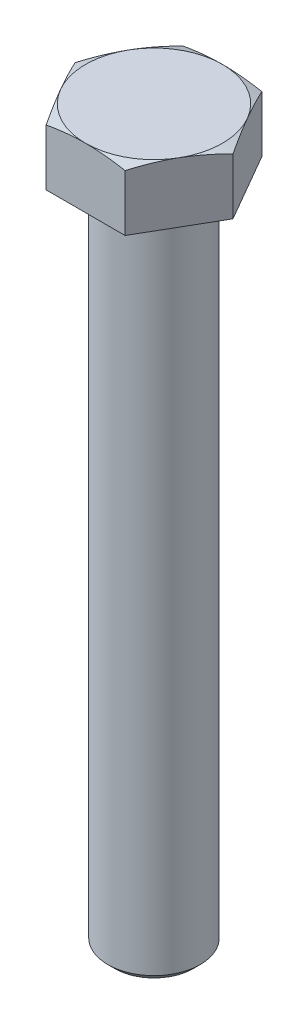
ISO-10303-21;
HEADER;
FILE_DESCRIPTION(('STEP AP214'),'2;1');
FILE_NAME('part.step','',(''),(''),'','','');
FILE_SCHEMA(('AUTOMOTIVE_DESIGN { 1 0 10303 214 1 1 1 1 }'));
ENDSEC;
DATA;
#1=APPLICATION_CONTEXT('core data for automotive mechanical design processes');
#2=APPLICATION_PROTOCOL_DEFINITION('international standard','automotive_design',2000,#1);
#3=PRODUCT_CONTEXT('',#1,'mechanical');
#4=PRODUCT('Part','Part','',(#3));
#5=PRODUCT_RELATED_PRODUCT_CATEGORY('part','',(#4));
#6=PRODUCT_DEFINITION_FORMATION('','',#4);
#7=PRODUCT_DEFINITION_CONTEXT('part definition',#1,'design');
#8=PRODUCT_DEFINITION('design','',#6,#7);
#9=PRODUCT_DEFINITION_SHAPE('','',#8);
#10=(LENGTH_UNIT() NAMED_UNIT(*) SI_UNIT(.MILLI.,.METRE.));
#11=(NAMED_UNIT(*) PLANE_ANGLE_UNIT() SI_UNIT($,.RADIAN.));
#12=(NAMED_UNIT(*) SI_UNIT($,.STERADIAN.) SOLID_ANGLE_UNIT());
#13=UNCERTAINTY_MEASURE_WITH_UNIT(LENGTH_MEASURE(1.E-05),#10,'distance_accuracy_value','');
#14=(GEOMETRIC_REPRESENTATION_CONTEXT(3) GLOBAL_UNCERTAINTY_ASSIGNED_CONTEXT((#13)) GLOBAL_UNIT_ASSIGNED_CONTEXT((#10,
#11,#12)) REPRESENTATION_CONTEXT('',''));
#15=CARTESIAN_POINT('',(0.,0.,0.));
#16=DIRECTION('',(0.,0.,1.));
#17=DIRECTION('',(1.,0.,0.));
#18=AXIS2_PLACEMENT_3D('',#15,#16,#17);
#19=CARTESIAN_POINT('',(-134.421042755759,85.6251261180788,156.216684572446));
#20=DIRECTION('',(0.,-1.,0.));
#21=DIRECTION('',(0.5,0.,-0.866025403784439));
#22=AXIS2_PLACEMENT_3D('',#19,#20,#21);
#23=PLANE('',#22);
#24=CARTESIAN_POINT('',(-134.421042755759,85.6251261180788,156.216684572446));
#25=DIRECTION('',(0.,-1.,0.));
#26=DIRECTION('',(0.5,0.,-0.866025403784439));
#27=AXIS2_PLACEMENT_3D('',#24,#25,#26);
#28=CIRCLE('',#27,7.647);
#29=CARTESIAN_POINT('',(-138.244542755759,85.6251261180788,162.839180835186));
#30=VERTEX_POINT('',#29);
#31=EDGE_CURVE('E271',#30,#30,#28,.T.);
#32=ORIENTED_EDGE('',*,*,#31,.T.);
#33=EDGE_LOOP('',(#32));
#34=FACE_BOUND('',#33,.T.);
#35=ADVANCED_FACE('F17',(#34),#23,.T.);
#36=CARTESIAN_POINT('',(-126.722076916115,227.845126118079,142.881684572446));
#37=DIRECTION('',(0.,-1.,0.));
#38=DIRECTION('',(0.866025403784439,0.,0.5));
#39=AXIS2_PLACEMENT_3D('',#36,#37,#38);
#40=PLANE('',#39);
#41=CARTESIAN_POINT('',(-134.421042755759,227.845126118079,156.216684572446));
#42=DIRECTION('',(0.,-1.,0.));
#43=DIRECTION('',(0.5,0.,-0.866025403784439));
#44=AXIS2_PLACEMENT_3D('',#41,#42,#43);
#45=CIRCLE('',#44,13.335);
#46=CARTESIAN_POINT('',(-122.872593996294,227.845126118079,149.549184572446));
#47=VERTEX_POINT('',#46);
#48=CARTESIAN_POINT('',(-122.872593996294,227.845126118079,162.884184572446));
#49=VERTEX_POINT('',#48);
#50=EDGE_CURVE('E11',#47,#49,#45,.T.);
#51=ORIENTED_EDGE('',*,*,#50,.F.);
#52=CARTESIAN_POINT('',(-134.421042755759,227.845126118079,156.216684572446));
#53=DIRECTION('',(0.,-1.,0.));
#54=DIRECTION('',(0.5,0.,-0.866025403784439));
#55=AXIS2_PLACEMENT_3D('',#52,#53,#54);
#56=CIRCLE('',#55,13.335);
#57=CARTESIAN_POINT('',(-134.421042755759,227.845126118079,142.881684572446));
#58=VERTEX_POINT('',#57);
#59=EDGE_CURVE('E214',#58,#47,#56,.T.);
#60=ORIENTED_EDGE('',*,*,#59,.F.);
#61=CARTESIAN_POINT('',(-134.421042755759,227.845126118079,156.216684572446));
#62=DIRECTION('',(0.,-1.,0.));
#63=DIRECTION('',(0.5,0.,-0.866025403784439));
#64=AXIS2_PLACEMENT_3D('',#61,#62,#63);
#65=CIRCLE('',#64,13.335);
#66=CARTESIAN_POINT('',(-145.969491515224,227.845126118079,149.549184572446));
#67=VERTEX_POINT('',#66);
#68=EDGE_CURVE('E451',#67,#58,#65,.T.);
#69=ORIENTED_EDGE('',*,*,#68,.F.);
#70=CARTESIAN_POINT('',(-134.421042755759,227.845126118079,156.216684572446));
#71=DIRECTION('',(0.,-1.,0.));
#72=DIRECTION('',(0.5,0.,-0.866025403784439));
#73=AXIS2_PLACEMENT_3D('',#70,#71,#72);
#74=CIRCLE('',#73,13.335);
#75=CARTESIAN_POINT('',(-145.969491515224,227.845126118079,162.884184572446));
#76=VERTEX_POINT('',#75);
#77=EDGE_CURVE('E46',#76,#67,#74,.T.);
#78=ORIENTED_EDGE('',*,*,#77,.F.);
#79=CARTESIAN_POINT('',(-134.421042755759,227.845126118079,156.216684572446));
#80=DIRECTION('',(0.,-1.,0.));
#81=DIRECTION('',(0.5,0.,-0.866025403784439));
#82=AXIS2_PLACEMENT_3D('',#79,#80,#81);
#83=CIRCLE('',#82,13.335);
#84=CARTESIAN_POINT('',(-134.421042755759,227.845126118079,169.551684572446));
#85=VERTEX_POINT('',#84);
#86=EDGE_CURVE('E345',#85,#76,#83,.T.);
#87=ORIENTED_EDGE('',*,*,#86,.F.);
#88=CARTESIAN_POINT('',(-134.421042755759,227.845126118079,156.216684572446));
#89=DIRECTION('',(0.,1.,0.));
#90=DIRECTION('',(-0.5,0.,0.866025403784439));
#91=AXIS2_PLACEMENT_3D('',#88,#89,#90);
#92=CIRCLE('',#91,13.335);
#93=EDGE_CURVE('E31',#85,#49,#92,.T.);
#94=ORIENTED_EDGE('',*,*,#93,.T.);
#95=EDGE_LOOP('',(#51,#60,#69,#78,#87,#94));
#96=FACE_BOUND('',#95,.T.);
#97=ADVANCED_FACE('F648',(#96),#40,.F.);
#98=CARTESIAN_POINT('',(-134.421042755759,227.845126118079,156.216684572446));
#99=DIRECTION('',(0.,-1.,0.));
#100=DIRECTION('',(0.5,0.,-0.866025403784439));
#101=AXIS2_PLACEMENT_3D('',#98,#99,#100);
#102=CONICAL_SURFACE('',#101,13.335,1.22173047639604);
#103=CARTESIAN_POINT('',(-122.872593996293,227.845126118079,162.884184572446));
#104=CARTESIAN_POINT('',(-122.765790007682,227.845139529122,162.699150701241));
#105=CARTESIAN_POINT('',(-122.658979524053,227.843270711422,162.514121087785));
#106=CARTESIAN_POINT('',(-122.44541330229,227.835805825219,162.14420583282));
#107=CARTESIAN_POINT('',(-122.338657559576,227.830211274858,161.959320163364));
#108=CARTESIAN_POINT('',(-122.124708196149,227.815299091096,161.588857858079));
#109=CARTESIAN_POINT('',(-122.017514733011,227.80596505759,161.403281793924));
#110=CARTESIAN_POINT('',(-121.803652725005,227.783729434206,161.032870627256));
#111=CARTESIAN_POINT('',(-121.696983623369,227.770839876457,160.848035121844));
#112=CARTESIAN_POINT('',(-121.48344316641,227.741496908851,160.478067254173));
#113=CARTESIAN_POINT('',(-121.376572087246,227.725033566838,160.292935521377));
#114=CARTESIAN_POINT('',(-121.162202468759,227.688555965655,159.921665318122));
#115=CARTESIAN_POINT('',(-121.054704703356,227.66851792925,159.735528743175));
#116=CARTESIAN_POINT('',(-120.842319573712,227.625631255484,159.367625790992));
#117=CARTESIAN_POINT('',(-120.737427122698,227.602854691653,159.185853923683));
#118=CARTESIAN_POINT('',(-120.527231042338,227.554140250437,158.821566761326));
#119=CARTESIAN_POINT('',(-120.421928494977,227.528185028157,158.639053164565));
#120=CARTESIAN_POINT('',(-120.210571777794,227.473118415611,158.272810997494));
#121=CARTESIAN_POINT('',(-120.104518924856,227.443981820732,158.089085463789));
#122=CARTESIAN_POINT('',(-119.891388364631,227.382560836724,157.719956415482));
#123=CARTESIAN_POINT('',(-119.78431246277,227.350244883217,157.534557118879));
#124=CARTESIAN_POINT('',(-119.568907364078,227.282470960763,157.161642245372));
#125=CARTESIAN_POINT('',(-119.460580732068,227.246976506213,156.97413183428));
#126=CARTESIAN_POINT('',(-119.242489323076,227.172849503322,156.59657962898));
#127=CARTESIAN_POINT('',(-119.132728231114,227.134176894393,156.40654356361));
#128=CARTESIAN_POINT('',(-119.023111076472,227.094280391494,156.216684572446));
#129=B_SPLINE_CURVE_WITH_KNOTS('',3,(#103,#104,#105,#106,#107,#108,#109,#110,#111,#112,#113,
#114,#115,#116,#117,#118,#119,#120,#121,#122,#123,#124,#125,#126,#127,#128),.UNSPECIFIED.,.F.,
.F.,(4,2,2,2,2,2,2,2,2,2,2,2,4),(0.,0.64092903534825,1.28159706788425,1.92510616174508,
2.56646374351991,3.2096271241323,3.85723989067546,4.49051020471908,5.12740443954068,
5.76977155017077,6.41932390012552,7.07763318267032,7.74612936264349),.UNSPECIFIED.);
#130=CARTESIAN_POINT('',(-119.023111076472,227.094280391494,156.216684572446));
#131=VERTEX_POINT('',#130);
#132=EDGE_CURVE('E367',#49,#131,#129,.T.);
#133=ORIENTED_EDGE('',*,*,#132,.T.);
#134=CARTESIAN_POINT('',(-119.023111076472,227.094280391494,156.216684572446));
#135=CARTESIAN_POINT('',(-119.132756640744,227.13418723506,156.026776378666));
#136=CARTESIAN_POINT('',(-119.24254601809,227.172869476151,155.836690887571));
#137=CARTESIAN_POINT('',(-119.460693942559,227.247014260088,155.459039454851));
#138=CARTESIAN_POINT('',(-119.569048806971,227.282516875322,155.271479245539));
#139=CARTESIAN_POINT('',(-119.784510642329,227.350305634547,154.89846422548));
#140=CARTESIAN_POINT('',(-119.891615048502,227.382628270402,154.713014581393));
#141=CARTESIAN_POINT('',(-120.104803311216,227.444061158296,154.343784126348));
#142=CARTESIAN_POINT('',(-120.210885360012,227.47320297367,154.160007531466));
#143=CARTESIAN_POINT('',(-120.422301431942,227.528278509732,153.79366222558));
#144=CARTESIAN_POINT('',(-120.527634136292,227.554237426006,153.611096548254));
#145=CARTESIAN_POINT('',(-120.737892556967,227.602957982891,153.246704351049));
#146=CARTESIAN_POINT('',(-120.842817186277,227.625736948077,153.064879523474));
#147=CARTESIAN_POINT('',(-121.055141013191,227.668600701295,152.697086697049));
#148=CARTESIAN_POINT('',(-121.162545011916,227.688617214428,152.511113489358));
#149=CARTESIAN_POINT('',(-121.376733844339,227.725058607975,152.140155056826));
#150=CARTESIAN_POINT('',(-121.483517923586,227.741506979666,151.955171710196));
#151=CARTESIAN_POINT('',(-121.696893012005,227.770827369729,151.585489515295));
#152=CARTESIAN_POINT('',(-121.803483747442,227.783709073214,151.400791278244));
#153=CARTESIAN_POINT('',(-122.017291721574,227.805945145915,151.030477050088));
#154=CARTESIAN_POINT('',(-122.124509677599,227.815284037549,150.844860541028));
#155=CARTESIAN_POINT('',(-122.338510290204,227.830203931071,150.474309848891));
#156=CARTESIAN_POINT('',(-122.445292797016,227.835801209464,150.28937623717));
#157=CARTESIAN_POINT('',(-122.658916761863,227.843269810107,149.919357888184));
#158=CARTESIAN_POINT('',(-122.765758224944,227.845139468884,149.734273120306));
#159=CARTESIAN_POINT('',(-122.872593996294,227.845126118079,149.549184572446));
#160=B_SPLINE_CURVE_WITH_KNOTS('',3,(#134,#135,#136,#137,#138,#139,#140,#141,#142,#143,#144,
#145,#146,#147,#148,#149,#150,#151,#152,#153,#154,#155,#156,#157,#158,#159),.UNSPECIFIED.,.F.,
.F.,(4,2,2,2,2,2,2,2,2,2,2,2,4),(0.,0.668669426706249,1.32715212151545,1.97687906689908,
2.61942310387391,3.25649786985065,3.88995371188233,4.53699789604124,5.17964340018021,
5.82052632409791,6.46417770261053,7.10501056923801,7.74612934740037),.UNSPECIFIED.);
#161=EDGE_CURVE('E501',#131,#47,#160,.T.);
#162=ORIENTED_EDGE('',*,*,#161,.T.);
#163=ORIENTED_EDGE('',*,*,#50,.T.);
#164=EDGE_LOOP('',(#133,#162,#163));
#165=FACE_BOUND('',#164,.T.);
#166=ADVANCED_FACE('F643',(#165),#102,.T.);
#167=CARTESIAN_POINT('',(-134.421042755759,227.845126118079,156.216684572446));
#168=DIRECTION('',(0.,-1.,0.));
#169=DIRECTION('',(0.5,0.,-0.866025403784439));
#170=AXIS2_PLACEMENT_3D('',#167,#168,#169);
#171=CONICAL_SURFACE('',#170,13.335,1.22173047639604);
#172=CARTESIAN_POINT('',(-126.722076916115,227.094280391494,169.551684572446));
#173=CARTESIAN_POINT('',(-126.612544264768,227.13414723875,169.361964974808));
#174=CARTESIAN_POINT('',(-126.50293004533,227.172791899346,169.172032662981));
#175=CARTESIAN_POINT('',(-126.285164977422,227.246868167139,168.794661600228));
#176=CARTESIAN_POINT('',(-126.177017243074,227.282339719239,168.607228885467));
#177=CARTESIAN_POINT('',(-125.96191888594,227.350072984148,168.234492654525));
#178=CARTESIAN_POINT('',(-125.854971445029,227.382371077056,168.049193929408));
#179=CARTESIAN_POINT('',(-125.642010175022,227.443761491557,167.680311864924));
#180=CARTESIAN_POINT('',(-125.535999084871,227.472885287675,167.496732190665));
#181=CARTESIAN_POINT('',(-125.324648471728,227.527931381378,167.130823308447));
#182=CARTESIAN_POINT('',(-125.219310911766,227.553878816315,166.94849675509));
#183=CARTESIAN_POINT('',(-125.009072637862,227.602582940768,166.584566275372));
#184=CARTESIAN_POINT('',(-124.904172845922,227.625356935044,166.402964135385));
#185=CARTESIAN_POINT('',(-124.691870469834,227.668248759611,166.035282499536));
#186=CARTESIAN_POINT('',(-124.584465628802,227.688293746064,165.849195783887));
#187=CARTESIAN_POINT('',(-124.370203549588,227.724789178958,165.478055094908));
#188=CARTESIAN_POINT('',(-124.263347564387,227.741263178747,165.293002720451));
#189=CARTESIAN_POINT('',(-124.049786414411,227.770631886611,164.923209386917));
#190=CARTESIAN_POINT('',(-123.943081644693,227.783536326839,164.738468973681));
#191=CARTESIAN_POINT('',(-123.729074953684,227.805827173462,164.367786376967));
#192=CARTESIAN_POINT('',(-123.621772918993,227.815194208103,164.181843090544));
#193=CARTESIAN_POINT('',(-123.407543219737,227.830159014542,163.81067710224));
#194=CARTESIAN_POINT('',(-123.300615978184,227.835773143533,163.6254548182));
#195=CARTESIAN_POINT('',(-123.086659196425,227.843264256765,163.254882224574));
#196=CARTESIAN_POINT('',(-122.979629631827,227.845139550998,163.069531894959));
#197=CARTESIAN_POINT('',(-122.872593996293,227.845126118079,162.884184572446));
#198=B_SPLINE_CURVE_WITH_KNOTS('',3,(#172,#173,#174,#175,#176,#177,#178,#179,#180,#181,#182,
#183,#184,#185,#186,#187,#188,#189,#190,#191,#192,#193,#194,#195,#196,#197),.UNSPECIFIED.,.F.,
.F.,(4,2,2,2,2,2,2,2,2,2,2,2,4),(0.,0.667999235771367,1.32583342383844,1.97492892204061,
2.61685336573369,3.25331461800518,3.88615671485517,4.53350368581595,5.1764414170247,
5.81760854744583,6.46223764349534,7.10403845220282,7.74612929843042),.UNSPECIFIED.);
#199=CARTESIAN_POINT('',(-126.722076916115,227.094280391494,169.551684572446));
#200=VERTEX_POINT('',#199);
#201=EDGE_CURVE('E378',#200,#49,#198,.T.);
#202=ORIENTED_EDGE('',*,*,#201,.T.);
#203=ORIENTED_EDGE('',*,*,#93,.F.);
#204=CARTESIAN_POINT('',(-134.421042755759,227.845126118079,169.551684572446));
#205=CARTESIAN_POINT('',(-134.207340796161,227.845139544043,169.55166257791));
#206=CARTESIAN_POINT('',(-133.993639277279,227.843269783899,169.551648249562));
#207=CARTESIAN_POINT('',(-133.566389330051,227.835801107808,169.551644122621));
#208=CARTESIAN_POINT('',(-133.3528408749,227.830203727574,169.551654313932));
#209=CARTESIAN_POINT('',(-132.92492693261,227.815283987172,169.551708510285));
#210=CARTESIAN_POINT('',(-132.710562019497,227.805945226263,169.551752665004));
#211=CARTESIAN_POINT('',(-132.282963727232,227.783710128196,169.551757024304));
#212=CARTESIAN_POINT('',(-132.069729521729,227.770829636219,169.551717597663));
#213=CARTESIAN_POINT('',(-131.642902471676,227.741510478687,169.551665465091));
#214=CARTESIAN_POINT('',(-131.429310309811,227.725061888441,169.551652834771));
#215=CARTESIAN_POINT('',(-131.000941927134,227.688619430133,169.551667441625));
#216=CARTESIAN_POINT('',(-130.786167730141,227.668601836371,169.551694955047));
#217=CARTESIAN_POINT('',(-130.361477645406,227.625737734377,169.551674408796));
#218=CARTESIAN_POINT('',(-130.151554817554,227.602959785089,169.551627930591));
#219=CARTESIAN_POINT('',(-129.730859922388,227.554240746452,169.551519339296));
#220=CARTESIAN_POINT('',(-129.520089867124,227.528282306657,169.551457138281));
#221=CARTESIAN_POINT('',(-129.097121367555,227.473207444465,169.551376230588));
#222=CARTESIAN_POINT('',(-128.884926213187,227.444065801177,169.551357902268));
#223=CARTESIAN_POINT('',(-128.458569415846,227.382632915935,169.551369872966));
#224=CARTESIAN_POINT('',(-128.244412331717,227.350310084719,169.551400718305));
#225=CARTESIAN_POINT('',(-127.813637416873,227.28252061049,169.551489691261));
#226=CARTESIAN_POINT('',(-127.597025346979,227.247017450554,169.551548181175));
#227=CARTESIAN_POINT('',(-127.160888134992,227.172871245615,169.551644911936));
#228=CARTESIAN_POINT('',(-126.941369802656,227.134188104291,169.551682825328));
#229=CARTESIAN_POINT('',(-126.722076916115,227.094280391494,169.551684572446));
#230=B_SPLINE_CURVE_WITH_KNOTS('',3,(#204,#205,#206,#207,#208,#209,#210,#211,#212,#213,#214,
#215,#216,#217,#218,#219,#220,#221,#222,#223,#224,#225,#226,#227,#228,#229),.UNSPECIFIED.,.F.,
.F.,(4,2,2,2,2,2,2,2,2,2,2,2,4),(0.,0.641096823772022,1.28192969039951,1.92560300316621,
2.56644219941095,3.20908728855609,3.85617561585054,4.48961798650377,5.1266842024838,
5.76922498897215,6.41895432906927,7.07744537608608,7.74612939189122),.UNSPECIFIED.);
#231=EDGE_CURVE('E357',#85,#200,#230,.T.);
#232=ORIENTED_EDGE('',*,*,#231,.T.);
#233=EDGE_LOOP('',(#202,#203,#232));
#234=FACE_BOUND('',#233,.T.);
#235=ADVANCED_FACE('F300',(#234),#171,.T.);
#236=CARTESIAN_POINT('',(-134.421042755759,227.845126118079,156.216684572446));
#237=DIRECTION('',(0.,-1.,0.));
#238=DIRECTION('',(0.5,0.,-0.866025403784439));
#239=AXIS2_PLACEMENT_3D('',#236,#237,#238);
#240=CONICAL_SURFACE('',#239,13.335,1.22173047639604);
#241=CARTESIAN_POINT('',(-142.120008595403,227.094280391494,169.551684572446));
#242=CARTESIAN_POINT('',(-141.900720493124,227.134187235049,169.551682825263));
#243=CARTESIAN_POINT('',(-141.681206940329,227.17286947613,169.551645180967));
#244=CARTESIAN_POINT('',(-141.245077243673,227.24701426005,169.551549252964));
#245=CARTESIAN_POINT('',(-141.028467905497,227.282516875277,169.551491292422));
#246=CARTESIAN_POINT('',(-140.597696504497,227.350305634493,169.551403379498));
#247=CARTESIAN_POINT('',(-140.383540198516,227.382628270346,169.551373064945));
#248=CARTESIAN_POINT('',(-139.957183113237,227.44406115824,169.551361841177));
#249=CARTESIAN_POINT('',(-139.744986889037,227.473202973616,169.551380389479));
#250=CARTESIAN_POINT('',(-139.322014511571,227.528278509686,169.551461353362));
#251=CARTESIAN_POINT('',(-139.111241644939,227.554237425967,169.551523394205));
#252=CARTESIAN_POINT('',(-138.690539534795,227.602957982869,169.551630359128));
#253=CARTESIAN_POINT('',(-138.480612300367,227.625736948065,169.551675378438));
#254=CARTESIAN_POINT('',(-138.055932455652,227.66860070132,169.551693963676));
#255=CARTESIAN_POINT('',(-137.841172933814,227.68861721448,169.551665976132));
#256=CARTESIAN_POINT('',(-137.412819091093,227.725058608052,169.55165222227));
#257=CARTESIAN_POINT('',(-137.199226774015,227.741506979746,169.55166617022));
#258=CARTESIAN_POINT('',(-136.772385057884,227.770827369781,169.551719020588));
#259=CARTESIAN_POINT('',(-136.559136325035,227.783709073238,169.55175785446));
#260=CARTESIAN_POINT('',(-136.131530808912,227.805945145915,169.551751831486));
#261=CARTESIAN_POINT('',(-135.917173218412,227.815284037547,169.551706612392));
#262=CARTESIAN_POINT('',(-135.48926659905,227.830203931064,169.551651991531));
#263=CARTESIAN_POINT('',(-135.275718139879,227.835801209461,169.55164243379));
#264=CARTESIAN_POINT('',(-134.848460867647,227.843269810106,169.551647827822));
#265=CARTESIAN_POINT('',(-134.63475202555,227.845139468886,169.551662790532));
#266=CARTESIAN_POINT('',(-134.421042755759,227.845126118079,169.551684572446));
#267=B_SPLINE_CURVE_WITH_KNOTS('',3,(#241,#242,#243,#244,#245,#246,#247,#248,#249,#250,#251,
#252,#253,#254,#255,#256,#257,#258,#259,#260,#261,#262,#263,#264,#265,#266),.UNSPECIFIED.,.F.,
.F.,(4,2,2,2,2,2,2,2,2,2,2,2,4),(0.,0.66866942653096,1.32715212123982,1.97687906659467,
2.61942310360859,3.25649786968804,3.88995371188157,4.53699789662004,5.17964340075013,
5.82052632409811,6.46417770344876,7.10501057007623,7.74612934739981),.UNSPECIFIED.);
#268=CARTESIAN_POINT('',(-142.120008595403,227.094280391494,169.551684572446));
#269=VERTEX_POINT('',#268);
#270=EDGE_CURVE('E358',#269,#85,#267,.T.);
#271=ORIENTED_EDGE('',*,*,#270,.T.);
#272=ORIENTED_EDGE('',*,*,#86,.T.);
#273=CARTESIAN_POINT('',(-145.969491515224,227.845126118079,162.884184572446));
#274=CARTESIAN_POINT('',(-145.862621487752,227.845139544046,163.069244900746));
#275=CARTESIAN_POINT('',(-145.755758319781,227.843269783898,163.254308680487));
#276=CARTESIAN_POINT('',(-145.54212977234,227.835801107804,163.624315924831));
#277=CARTESIAN_POINT('',(-145.435364370722,227.830203727565,163.809259407599));
#278=CARTESIAN_POINT('',(-145.221454334821,227.815283987169,164.179870850703));
#279=CARTESIAN_POINT('',(-145.114310117174,227.805945226265,164.365538388754));
#280=CARTESIAN_POINT('',(-144.900514746302,227.783710128233,164.735851551965));
#281=CARTESIAN_POINT('',(-144.793863499274,227.770829636301,164.920498077157));
#282=CARTESIAN_POINT('',(-144.580404826349,227.741510478814,165.290115078845));
#283=CARTESIAN_POINT('',(-144.473597807277,227.72506188856,165.475085001925));
#284=CARTESIAN_POINT('',(-144.259426265656,227.688619430213,165.846070207343));
#285=CARTESIAN_POINT('',(-144.152062994253,227.668601836412,166.032083875125));
#286=CARTESIAN_POINT('',(-143.939700158098,227.625737734391,166.399866004425));
#287=CARTESIAN_POINT('',(-143.834698492881,227.602959785122,166.581641266991));
#288=CARTESIAN_POINT('',(-143.624257002517,227.554240746514,166.945919437667));
#289=CARTESIAN_POINT('',(-143.51881810725,227.528282306727,167.128420559329));
#290=CARTESIAN_POINT('',(-143.307263789385,227.473207444548,167.494681571049));
#291=CARTESIAN_POINT('',(-143.201150339424,227.444065801264,167.678438801116));
#292=CARTESIAN_POINT('',(-142.987982307696,227.382632916022,168.04768060404));
#293=CARTESIAN_POINT('',(-142.880930478481,227.350310084802,168.233161501983));
#294=CARTESIAN_POINT('',(-142.665620073883,227.282520610559,168.606268008096));
#295=CARTESIAN_POINT('',(-142.55736469267,227.247017450614,168.793888808396));
#296=CARTESIAN_POINT('',(-142.339379857916,227.172871245648,169.171643079022));
#297=CARTESIAN_POINT('',(-142.229653525669,227.134188104307,169.361770488196));
#298=CARTESIAN_POINT('',(-142.120008595403,227.094280391494,169.551684572446));
#299=B_SPLINE_CURVE_WITH_KNOTS('',3,(#273,#274,#275,#276,#277,#278,#279,#280,#281,#282,#283,
#284,#285,#286,#287,#288,#289,#290,#291,#292,#293,#294,#295,#296,#297,#298),.UNSPECIFIED.,.F.,
.F.,(4,2,2,2,2,2,2,2,2,2,2,2,4),(0.,0.641096822809083,1.28192968943654,1.92560300316528,
2.56644219804608,3.20908728717653,3.8561756158501,4.48961798625283,5.12668420207381,
5.76922498850173,6.41895432864337,7.07744537581554,7.74612939189196),.UNSPECIFIED.);
#300=EDGE_CURVE('E127',#76,#269,#299,.T.);
#301=ORIENTED_EDGE('',*,*,#300,.T.);
#302=EDGE_LOOP('',(#271,#272,#301));
#303=FACE_BOUND('',#302,.T.);
#304=ADVANCED_FACE('F297',(#303),#240,.T.);
#305=CARTESIAN_POINT('',(-134.421042755759,227.845126118079,156.216684572446));
#306=DIRECTION('',(0.,-1.,0.));
#307=DIRECTION('',(0.5,0.,-0.866025403784439));
#308=AXIS2_PLACEMENT_3D('',#305,#306,#307);
#309=CONICAL_SURFACE('',#308,13.335,1.22173047639604);
#310=CARTESIAN_POINT('',(-149.818974435046,227.094280391494,156.216684572446));
#311=CARTESIAN_POINT('',(-149.709328870814,227.134187235045,156.406592766155));
#312=CARTESIAN_POINT('',(-149.599539493513,227.172869476121,156.596678257183));
#313=CARTESIAN_POINT('',(-149.38139156912,227.247014260034,156.974329689799));
#314=CARTESIAN_POINT('',(-149.273036704738,227.282516875259,157.161889899075));
#315=CARTESIAN_POINT('',(-149.057574869427,227.350305634471,157.534904919091));
#316=CARTESIAN_POINT('',(-148.950470463267,227.382628270323,157.720354563172));
#317=CARTESIAN_POINT('',(-148.737282200562,227.444061158217,158.089585018227));
#318=CARTESIAN_POINT('',(-148.631200151761,227.473202973594,158.273361613127));
#319=CARTESIAN_POINT('',(-148.419784079798,227.528278509667,158.63970691907));
#320=CARTESIAN_POINT('',(-148.314451375422,227.55423742595,158.822272596436));
#321=CARTESIAN_POINT('',(-148.104192954663,227.602957982861,159.186664793734));
#322=CARTESIAN_POINT('',(-147.999268325295,227.625736948063,159.368489621363));
#323=CARTESIAN_POINT('',(-147.786944498371,227.668600701289,159.736282447727));
#324=CARTESIAN_POINT('',(-147.679540499695,227.688617214418,159.922255655305));
#325=CARTESIAN_POINT('',(-147.465351667329,227.725058607959,160.29321408773));
#326=CARTESIAN_POINT('',(-147.358567588091,227.741506979649,160.478197434366));
#327=CARTESIAN_POINT('',(-147.145192499626,227.770827369717,160.847879629382));
#328=CARTESIAN_POINT('',(-147.038601764135,227.783709073209,161.032577866541));
#329=CARTESIAN_POINT('',(-146.824793789945,227.805945145914,161.402892094808));
#330=CARTESIAN_POINT('',(-146.717575833918,227.815284037549,161.588508603869));
#331=CARTESIAN_POINT('',(-146.503575221311,227.830203931071,161.959059296007));
#332=CARTESIAN_POINT('',(-146.396792714499,227.835801209464,162.143992907729));
#333=CARTESIAN_POINT('',(-146.183168749653,227.843269810107,162.514011256713));
#334=CARTESIAN_POINT('',(-146.076327286573,227.845139468884,162.699096024589));
#335=CARTESIAN_POINT('',(-145.969491515224,227.845126118079,162.884184572446));
#336=B_SPLINE_CURVE_WITH_KNOTS('',3,(#310,#311,#312,#313,#314,#315,#316,#317,#318,#319,#320,
#321,#322,#323,#324,#325,#326,#327,#328,#329,#330,#331,#332,#333,#334,#335),.UNSPECIFIED.,.F.,
.F.,(4,2,2,2,2,2,2,2,2,2,2,2,4),(0.,0.668669426458363,1.32715212112566,1.9768790664686,
2.61942310349868,3.25649786962069,3.88995371188126,4.53699789567316,5.17964339981441,
5.82052632409715,6.46417770261706,7.10501056924455,7.74612934739961),.UNSPECIFIED.);
#337=CARTESIAN_POINT('',(-149.818974435046,227.094280391494,156.216684572446));
#338=VERTEX_POINT('',#337);
#339=EDGE_CURVE('E318',#338,#76,#336,.T.);
#340=ORIENTED_EDGE('',*,*,#339,.T.);
#341=ORIENTED_EDGE('',*,*,#77,.T.);
#342=CARTESIAN_POINT('',(-145.969491515224,227.845126118079,149.549184572446));
#343=CARTESIAN_POINT('',(-146.076485333089,227.845139626545,149.734547565022));
#344=CARTESIAN_POINT('',(-146.183485521508,227.843264230413,149.919906366467));
#345=CARTESIAN_POINT('',(-146.397429837302,227.835773041345,150.290477666725));
#346=CARTESIAN_POINT('',(-146.504373969436,227.830158809979,150.475690194311));
#347=CARTESIAN_POINT('',(-146.718701600634,227.815194157451,150.846808129764));
#348=CARTESIAN_POINT('',(-146.826084941669,227.805827254209,151.032712961762));
#349=CARTESIAN_POINT('',(-147.040097072236,227.783537386676,151.403384054281));
#350=CARTESIAN_POINT('',(-147.146726775105,227.770634163447,151.58815097811));
#351=CARTESIAN_POINT('',(-147.360189887318,227.741266693666,151.957983923532));
#352=CARTESIAN_POINT('',(-147.467023019366,227.72479247453,152.143049312172));
#353=CARTESIAN_POINT('',(-147.681317280605,227.688295971878,152.51418826475));
#354=CARTESIAN_POINT('',(-147.788777633303,227.668249899771,152.700259931497));
#355=CARTESIAN_POINT('',(-148.001051517798,227.625357723562,153.067969882412));
#356=CARTESIAN_POINT('',(-148.105870213544,227.602584747727,153.249613741011));
#357=CARTESIAN_POINT('',(-148.315919089091,227.553882145435,153.613645216054));
#358=CARTESIAN_POINT('',(-148.421148187711,227.527935188301,153.796031134597));
#359=CARTESIAN_POINT('',(-148.632357373305,227.472889770293,154.162017180402));
#360=CARTESIAN_POINT('',(-148.738336144326,227.443766146723,154.345614275652));
#361=CARTESIAN_POINT('',(-148.95131725194,227.382375734877,154.714484553901));
#362=CARTESIAN_POINT('',(-149.058317785379,227.350077446109,154.899753527184));
#363=CARTESIAN_POINT('',(-149.273570333034,227.282343464304,155.27240480482));
#364=CARTESIAN_POINT('',(-149.38181978712,227.246871366071,155.459781954545));
#365=CARTESIAN_POINT('',(-149.599754644251,227.172793673509,155.837063690662));
#366=CARTESIAN_POINT('',(-149.709436371127,227.134148110308,156.026962560674));
#367=CARTESIAN_POINT('',(-149.818974435046,227.094280391494,156.216684572446));
#368=B_SPLINE_CURVE_WITH_KNOTS('',3,(#342,#343,#344,#345,#346,#347,#348,#349,#350,#351,#352,
#353,#354,#355,#356,#357,#358,#359,#360,#361,#362,#363,#364,#365,#366,#367),.UNSPECIFIED.,.F.,
.F.,(4,2,2,2,2,2,2,2,2,2,2,2,4),(0.,0.642068808616925,1.28386961732441,1.92852073071069,
2.56964399148841,3.2125813057023,3.85997256379276,4.49280115192826,5.12925383112512,
5.77117501603899,6.42027291594796,7.07811547898077,7.74612934283124),.UNSPECIFIED.);
#369=EDGE_CURVE('E279',#67,#338,#368,.T.);
#370=ORIENTED_EDGE('',*,*,#369,.T.);
#371=EDGE_LOOP('',(#340,#341,#370));
#372=FACE_BOUND('',#371,.T.);
#373=ADVANCED_FACE('F286',(#372),#309,.T.);
#374=CARTESIAN_POINT('',(-134.421042755759,227.845126118079,156.216684572446));
#375=DIRECTION('',(0.,-1.,0.));
#376=DIRECTION('',(0.5,0.,-0.866025403784439));
#377=AXIS2_PLACEMENT_3D('',#374,#375,#376);
#378=CONICAL_SURFACE('',#377,13.335,1.22173047639604);
#379=CARTESIAN_POINT('',(-134.421042755759,227.845126118079,142.881684572446));
#380=CARTESIAN_POINT('',(-134.634744714768,227.845139544048,142.881706566996));
#381=CARTESIAN_POINT('',(-134.84844623306,227.843269783897,142.881720895295));
#382=CARTESIAN_POINT('',(-135.275696179698,227.835801107801,142.881725022136));
#383=CARTESIAN_POINT('',(-135.489244634848,227.830203727559,142.881714830776));
#384=CARTESIAN_POINT('',(-135.917158577729,227.815283987166,142.881660634451));
#385=CARTESIAN_POINT('',(-136.131523491431,227.805945226266,142.881616479809));
#386=CARTESIAN_POINT('',(-136.559121783687,227.783710128255,142.881612120666));
#387=CARTESIAN_POINT('',(-136.772355988592,227.770829636347,142.881651547385));
#388=CARTESIAN_POINT('',(-137.19918303804,227.741510478885,142.881703679981));
#389=CARTESIAN_POINT('',(-137.412775199897,227.725061888629,142.881716310245));
#390=CARTESIAN_POINT('',(-137.841143583173,227.688619430259,142.881701703305));
#391=CARTESIAN_POINT('',(-138.055917780772,227.668601836435,142.881674189854));
#392=CARTESIAN_POINT('',(-138.480607866102,227.625737734375,142.881694736087));
#393=CARTESIAN_POINT('',(-138.690530693945,227.602959785092,142.881741214303));
#394=CARTESIAN_POINT('',(-139.111225589096,227.55424074646,142.881849805608));
#395=CARTESIAN_POINT('',(-139.321995644354,227.528282306665,142.881912006621));
#396=CARTESIAN_POINT('',(-139.744964143915,227.473207444474,142.881992914312));
#397=CARTESIAN_POINT('',(-139.957159298281,227.444065801187,142.882011242632));
#398=CARTESIAN_POINT('',(-140.383516095621,227.382632915945,142.881999271933));
#399=CARTESIAN_POINT('',(-140.597673179751,227.350310084728,142.881968426592));
#400=CARTESIAN_POINT('',(-141.028448094603,227.282520610498,142.881879453634));
#401=CARTESIAN_POINT('',(-141.245060164503,227.247017450561,142.88182096372));
#402=CARTESIAN_POINT('',(-141.681197376506,227.172871245619,142.881724232957));
#403=CARTESIAN_POINT('',(-141.900715708852,227.134188104293,142.881686319564));
#404=CARTESIAN_POINT('',(-142.120008595403,227.094280391494,142.881684572446));
#405=B_SPLINE_CURVE_WITH_KNOTS('',3,(#379,#380,#381,#382,#383,#384,#385,#386,#387,#388,#389,
#390,#391,#392,#393,#394,#395,#396,#397,#398,#399,#400,#401,#402,#403,#404),.UNSPECIFIED.,.F.,
.F.,(4,2,2,2,2,2,2,2,2,2,2,2,4),(0.,0.641096822003138,1.28192968863063,1.92560300316465,
2.56644219760636,3.20908728672896,3.85617561585044,4.48961798647506,5.1266842024369,
5.76922498891837,6.41895432902056,7.0774453760551,7.74612939189117),.UNSPECIFIED.);
#406=CARTESIAN_POINT('',(-142.120008595403,227.094280391494,142.881684572446));
#407=VERTEX_POINT('',#406);
#408=EDGE_CURVE('E424',#58,#407,#405,.T.);
#409=ORIENTED_EDGE('',*,*,#408,.T.);
#410=CARTESIAN_POINT('',(-142.120008595403,227.094280391494,142.881684572446));
#411=CARTESIAN_POINT('',(-142.229620328692,227.134176022721,143.071541153795));
#412=CARTESIAN_POINT('',(-142.339313680133,227.172847728898,143.261610794805));
#413=CARTESIAN_POINT('',(-142.557234705446,227.246973306806,143.639252668901));
#414=CARTESIAN_POINT('',(-142.665459258823,227.282467215131,143.826818851935));
#415=CARTESIAN_POINT('',(-142.880709621824,227.350240420579,144.199818993242));
#416=CARTESIAN_POINT('',(-142.987732242233,227.382556178185,144.385248150799));
#417=CARTESIAN_POINT('',(-143.200842888062,227.443977164846,144.754389029995));
#418=CARTESIAN_POINT('',(-143.306928168507,227.473113932289,144.938097080418));
#419=CARTESIAN_POINT('',(-143.518426823646,227.528181220621,145.304261789876));
#420=CARTESIAN_POINT('',(-143.623838231804,227.554136920755,145.486715791209));
#421=CARTESIAN_POINT('',(-143.834224334272,227.60285288438,145.850901598846));
#422=CARTESIAN_POINT('',(-143.939198106647,227.62563046683,146.032631617893));
#423=CARTESIAN_POINT('',(-144.151612011133,227.668516792046,146.400506111279));
#424=CARTESIAN_POINT('',(-144.259054365339,227.68855374576,146.586657696589));
#425=CARTESIAN_POINT('',(-144.473392438618,227.725030280186,146.957929287716));
#426=CARTESIAN_POINT('',(-144.580286904884,227.741493403036,147.143047697688));
#427=CARTESIAN_POINT('',(-144.793926221231,227.770837605608,147.512975459668));
#428=CARTESIAN_POINT('',(-144.900670678655,227.783728377219,147.697784268561));
#429=CARTESIAN_POINT('',(-145.114527333928,227.805964977106,148.068206890538));
#430=CARTESIAN_POINT('',(-145.221639598849,227.815299141518,148.253821367116));
#431=CARTESIAN_POINT('',(-145.4354906499,227.830211478596,148.624331965326));
#432=CARTESIAN_POINT('',(-145.542229016436,227.835805926995,148.809227671569));
#433=CARTESIAN_POINT('',(-145.75580667991,227.843270737654,149.179144790812));
#434=CARTESIAN_POINT('',(-145.862646000605,227.845139453869,149.364166223262));
#435=CARTESIAN_POINT('',(-145.969491515224,227.845126118079,149.549184572446));
#436=B_SPLINE_CURVE_WITH_KNOTS('',3,(#410,#411,#412,#413,#414,#415,#416,#417,#418,#419,#420,
#421,#422,#423,#424,#425,#426,#427,#428,#429,#430,#431,#432,#433,#434,#435),.UNSPECIFIED.,.F.,
.F.,(4,2,2,2,2,2,2,2,2,2,2,2,4),(0.,0.668481549913369,1.32678245667664,1.97633240502762,
2.61870277516043,3.2556055840495,3.8888894076707,4.53645793820685,5.17962173495515,
5.82102313615711,6.46451026555659,7.10517829809258,7.7461293180556),.UNSPECIFIED.);
#437=EDGE_CURVE('E465',#407,#67,#436,.T.);
#438=ORIENTED_EDGE('',*,*,#437,.T.);
#439=ORIENTED_EDGE('',*,*,#68,.T.);
#440=EDGE_LOOP('',(#409,#438,#439));
#441=FACE_BOUND('',#440,.T.);
#442=ADVANCED_FACE('F296',(#441),#378,.T.);
#443=CARTESIAN_POINT('',(-149.818974435046,216.125126118079,156.216684572446));
#444=DIRECTION('',(0.866025403784439,0.,0.5));
#445=DIRECTION('',(0.5,0.,-0.866025403784439));
#446=AXIS2_PLACEMENT_3D('',#443,#444,#445);
#447=PLANE('',#446);
#448=ORIENTED_EDGE('',*,*,#437,.F.);
#449=DIRECTION('',(0.,1.,0.));
#450=VECTOR('',#449,1.);
#451=CARTESIAN_POINT('',(-142.120008595403,216.125126118079,142.881684572446));
#452=LINE('',#451,#450);
#453=CARTESIAN_POINT('',(-142.120008595403,216.125126118079,142.881684572446));
#454=VERTEX_POINT('',#453);
#455=EDGE_CURVE('E420',#454,#407,#452,.T.);
#456=ORIENTED_EDGE('',*,*,#455,.F.);
#457=DIRECTION('',(0.5,0.,-0.866025403784439));
#458=VECTOR('',#457,1.);
#459=CARTESIAN_POINT('',(-149.818974435046,216.125126118079,156.216684572446));
#460=LINE('',#459,#458);
#461=CARTESIAN_POINT('',(-145.969491515224,216.125126118079,149.549184572446));
#462=VERTEX_POINT('',#461);
#463=EDGE_CURVE('E247',#462,#454,#460,.T.);
#464=ORIENTED_EDGE('',*,*,#463,.F.);
#465=DIRECTION('',(0.5,0.,-0.866025403784439));
#466=VECTOR('',#465,1.);
#467=CARTESIAN_POINT('',(-149.818974435046,216.125126118079,156.216684572446));
#468=LINE('',#467,#466);
#469=CARTESIAN_POINT('',(-149.818974435046,216.125126118079,156.216684572446));
#470=VERTEX_POINT('',#469);
#471=EDGE_CURVE('E251',#470,#462,#468,.T.);
#472=ORIENTED_EDGE('',*,*,#471,.F.);
#473=DIRECTION('',(0.,1.,0.));
#474=VECTOR('',#473,1.);
#475=CARTESIAN_POINT('',(-149.818974435046,216.125126118079,156.216684572446));
#476=LINE('',#475,#474);
#477=EDGE_CURVE('E457',#470,#338,#476,.T.);
#478=ORIENTED_EDGE('',*,*,#477,.T.);
#479=ORIENTED_EDGE('',*,*,#369,.F.);
#480=EDGE_LOOP('',(#448,#456,#464,#472,#478,#479));
#481=FACE_BOUND('',#480,.T.);
#482=ADVANCED_FACE('F334',(#481),#447,.F.);
#483=CARTESIAN_POINT('',(-142.120008595403,216.125126118079,169.551684572446));
#484=DIRECTION('',(0.866025403784439,0.,-0.5));
#485=DIRECTION('',(0.,1.,0.));
#486=AXIS2_PLACEMENT_3D('',#483,#484,#485);
#487=PLANE('',#486);
#488=ORIENTED_EDGE('',*,*,#339,.F.);
#489=ORIENTED_EDGE('',*,*,#477,.F.);
#490=DIRECTION('',(-0.5,0.,-0.866025403784439));
#491=VECTOR('',#490,1.);
#492=CARTESIAN_POINT('',(-142.120008595403,216.125126118079,169.551684572446));
#493=LINE('',#492,#491);
#494=CARTESIAN_POINT('',(-145.969491515224,216.125126118079,162.884184572446));
#495=VERTEX_POINT('',#494);
#496=EDGE_CURVE('E231',#495,#470,#493,.T.);
#497=ORIENTED_EDGE('',*,*,#496,.F.);
#498=DIRECTION('',(-0.5,0.,-0.866025403784439));
#499=VECTOR('',#498,1.);
#500=CARTESIAN_POINT('',(-142.120008595403,216.125126118079,169.551684572446));
#501=LINE('',#500,#499);
#502=CARTESIAN_POINT('',(-142.120008595403,216.125126118079,169.551684572446));
#503=VERTEX_POINT('',#502);
#504=EDGE_CURVE('E163',#503,#495,#501,.T.);
#505=ORIENTED_EDGE('',*,*,#504,.F.);
#506=DIRECTION('',(0.,1.,0.));
#507=VECTOR('',#506,1.);
#508=CARTESIAN_POINT('',(-142.120008595403,216.125126118079,169.551684572446));
#509=LINE('',#508,#507);
#510=EDGE_CURVE('E355',#503,#269,#509,.T.);
#511=ORIENTED_EDGE('',*,*,#510,.T.);
#512=ORIENTED_EDGE('',*,*,#300,.F.);
#513=EDGE_LOOP('',(#488,#489,#497,#505,#511,#512));
#514=FACE_BOUND('',#513,.T.);
#515=ADVANCED_FACE('F324',(#514),#487,.F.);
#516=CARTESIAN_POINT('',(-126.722076916115,216.125126118079,169.551684572446));
#517=DIRECTION('',(0.,0.,-1.));
#518=DIRECTION('',(-1.,0.,0.));
#519=AXIS2_PLACEMENT_3D('',#516,#517,#518);
#520=PLANE('',#519);
#521=ORIENTED_EDGE('',*,*,#270,.F.);
#522=ORIENTED_EDGE('',*,*,#510,.F.);
#523=DIRECTION('',(-1.,0.,0.));
#524=VECTOR('',#523,1.);
#525=CARTESIAN_POINT('',(-126.722076916115,216.125126118079,169.551684572446));
#526=LINE('',#525,#524);
#527=CARTESIAN_POINT('',(-134.421042755759,216.125126118079,169.551684572446));
#528=VERTEX_POINT('',#527);
#529=EDGE_CURVE('E175',#528,#503,#526,.T.);
#530=ORIENTED_EDGE('',*,*,#529,.F.);
#531=DIRECTION('',(-1.,0.,0.));
#532=VECTOR('',#531,1.);
#533=CARTESIAN_POINT('',(-126.722076916115,216.125126118079,169.551684572446));
#534=LINE('',#533,#532);
#535=CARTESIAN_POINT('',(-126.722076916115,216.125126118079,169.551684572446));
#536=VERTEX_POINT('',#535);
#537=EDGE_CURVE('E206',#536,#528,#534,.T.);
#538=ORIENTED_EDGE('',*,*,#537,.F.);
#539=DIRECTION('',(0.,1.,0.));
#540=VECTOR('',#539,1.);
#541=CARTESIAN_POINT('',(-126.722076916115,216.125126118079,169.551684572446));
#542=LINE('',#541,#540);
#543=EDGE_CURVE('E203',#536,#200,#542,.T.);
#544=ORIENTED_EDGE('',*,*,#543,.T.);
#545=ORIENTED_EDGE('',*,*,#231,.F.);
#546=EDGE_LOOP('',(#521,#522,#530,#538,#544,#545));
#547=FACE_BOUND('',#546,.T.);
#548=ADVANCED_FACE('F19',(#547),#520,.F.);
#549=CARTESIAN_POINT('',(-119.023111076472,216.125126118079,156.216684572446));
#550=DIRECTION('',(-0.866025403784439,0.,-0.5));
#551=DIRECTION('',(0.5,0.,-0.866025403784439));
#552=AXIS2_PLACEMENT_3D('',#549,#550,#551);
#553=PLANE('',#552);
#554=ORIENTED_EDGE('',*,*,#201,.F.);
#555=ORIENTED_EDGE('',*,*,#543,.F.);
#556=DIRECTION('',(-0.5,0.,0.866025403784439));
#557=VECTOR('',#556,1.);
#558=CARTESIAN_POINT('',(-119.023111076472,216.125126118079,156.216684572446));
#559=LINE('',#558,#557);
#560=CARTESIAN_POINT('',(-122.872593996294,216.125126118079,162.884184572446));
#561=VERTEX_POINT('',#560);
#562=EDGE_CURVE('E196',#561,#536,#559,.T.);
#563=ORIENTED_EDGE('',*,*,#562,.F.);
#564=DIRECTION('',(-0.5,0.,0.866025403784439));
#565=VECTOR('',#564,1.);
#566=CARTESIAN_POINT('',(-119.023111076472,216.125126118079,156.216684572446));
#567=LINE('',#566,#565);
#568=CARTESIAN_POINT('',(-119.023111076472,216.125126118079,156.216684572446));
#569=VERTEX_POINT('',#568);
#570=EDGE_CURVE('E185',#569,#561,#567,.T.);
#571=ORIENTED_EDGE('',*,*,#570,.F.);
#572=DIRECTION('',(0.,1.,0.));
#573=VECTOR('',#572,1.);
#574=CARTESIAN_POINT('',(-119.023111076472,216.125126118079,156.216684572446));
#575=LINE('',#574,#573);
#576=EDGE_CURVE('E385',#569,#131,#575,.T.);
#577=ORIENTED_EDGE('',*,*,#576,.T.);
#578=ORIENTED_EDGE('',*,*,#132,.F.);
#579=EDGE_LOOP('',(#554,#555,#563,#571,#577,#578));
#580=FACE_BOUND('',#579,.T.);
#581=ADVANCED_FACE('F201',(#580),#553,.F.);
#582=CARTESIAN_POINT('',(-126.722076916115,216.125126118079,142.881684572446));
#583=DIRECTION('',(-0.866025403784439,0.,0.5));
#584=DIRECTION('',(0.,1.,0.));
#585=AXIS2_PLACEMENT_3D('',#582,#583,#584);
#586=PLANE('',#585);
#587=ORIENTED_EDGE('',*,*,#161,.F.);
#588=ORIENTED_EDGE('',*,*,#576,.F.);
#589=DIRECTION('',(0.5,0.,0.866025403784439));
#590=VECTOR('',#589,1.);
#591=CARTESIAN_POINT('',(-126.722076916115,216.125126118079,142.881684572446));
#592=LINE('',#591,#590);
#593=CARTESIAN_POINT('',(-122.872593996294,216.125126118079,149.549184572446));
#594=VERTEX_POINT('',#593);
#595=EDGE_CURVE('E192',#594,#569,#592,.T.);
#596=ORIENTED_EDGE('',*,*,#595,.F.);
#597=DIRECTION('',(0.5,0.,0.866025403784439));
#598=VECTOR('',#597,1.);
#599=CARTESIAN_POINT('',(-126.722076916115,216.125126118079,142.881684572446));
#600=LINE('',#599,#598);
#601=CARTESIAN_POINT('',(-126.722076916115,216.125126118079,142.881684572446));
#602=VERTEX_POINT('',#601);
#603=EDGE_CURVE('E233',#602,#594,#600,.T.);
#604=ORIENTED_EDGE('',*,*,#603,.F.);
#605=DIRECTION('',(0.,1.,0.));
#606=VECTOR('',#605,1.);
#607=CARTESIAN_POINT('',(-126.722076916115,216.125126118079,142.881684572446));
#608=LINE('',#607,#606);
#609=CARTESIAN_POINT('',(-126.722076916115,227.094280391494,142.881684572446));
#610=VERTEX_POINT('',#609);
#611=EDGE_CURVE('E276',#602,#610,#608,.T.);
#612=ORIENTED_EDGE('',*,*,#611,.T.);
#613=CARTESIAN_POINT('',(-122.872593996294,227.845126118079,149.549184572446));
#614=CARTESIAN_POINT('',(-122.979464023904,227.845139544043,149.364124243891));
#615=CARTESIAN_POINT('',(-123.086327192041,227.843269783899,149.179060463911));
#616=CARTESIAN_POINT('',(-123.299955739671,227.835801107808,148.809053219341));
#617=CARTESIAN_POINT('',(-123.40672114131,227.830203727574,148.624109736586));
#618=CARTESIAN_POINT('',(-123.620631177052,227.815283987171,148.253498293725));
#619=CARTESIAN_POINT('',(-123.727775394517,227.805945226262,148.067830755903));
#620=CARTESIAN_POINT('',(-123.941570765496,227.78371012819,147.697517592376));
#621=CARTESIAN_POINT('',(-124.048222012815,227.770829636207,147.51287106664));
#622=CARTESIAN_POINT('',(-124.261680686081,227.741510478669,147.143254064429));
#623=CARTESIAN_POINT('',(-124.368487705205,227.725061888424,146.958284141371));
#624=CARTESIAN_POINT('',(-124.582659246545,227.688619430122,146.587298936504));
#625=CARTESIAN_POINT('',(-124.690022517616,227.668601836365,146.401285269251));
#626=CARTESIAN_POINT('',(-124.902385353482,227.625737734355,146.033503140271));
#627=CARTESIAN_POINT('',(-125.007387018742,227.602959785041,145.851727877499));
#628=CARTESIAN_POINT('',(-125.217828509206,227.554240746364,145.487449706503));
#629=CARTESIAN_POINT('',(-125.32326740453,227.528282306555,145.304948584727));
#630=CARTESIAN_POINT('',(-125.534821722485,227.473207444346,144.938687572857));
#631=CARTESIAN_POINT('',(-125.640935172479,227.444065801053,144.754930342752));
#632=CARTESIAN_POINT('',(-125.854103204242,227.382632915811,144.385688539834));
#633=CARTESIAN_POINT('',(-125.961155033461,227.3503100846,144.200207641933));
#634=CARTESIAN_POINT('',(-126.176465438021,227.28252061039,143.827101135983));
#635=CARTESIAN_POINT('',(-126.284720819193,227.247017450469,143.639480335801));
#636=CARTESIAN_POINT('',(-126.502705653808,227.172871245568,143.261726065489));
#637=CARTESIAN_POINT('',(-126.612431985958,227.134188104268,143.071598656508));
#638=CARTESIAN_POINT('',(-126.722076916115,227.094280391494,142.881684572446));
#639=B_SPLINE_CURVE_WITH_KNOTS('',3,(#613,#614,#615,#616,#617,#618,#619,#620,#621,#622,#623,
#624,#625,#626,#627,#628,#629,#630,#631,#632,#633,#634,#635,#636,#637,#638),.UNSPECIFIED.,.F.,
.F.,(4,2,2,2,2,2,2,2,2,2,2,2,4),(0.,0.641096823678435,1.28192969030592,1.92560300316616,
2.56644219990363,3.20908728905132,3.85617561585104,4.48961798686414,5.12668420307253,
5.7692249896477,6.41895432968086,7.07744537647455,7.74612939188996),.UNSPECIFIED.);
#640=EDGE_CURVE('E491',#47,#610,#639,.T.);
#641=ORIENTED_EDGE('',*,*,#640,.F.);
#642=EDGE_LOOP('',(#587,#588,#596,#604,#612,#641));
#643=FACE_BOUND('',#642,.T.);
#644=ADVANCED_FACE('F406',(#643),#586,.F.);
#645=CARTESIAN_POINT('',(-142.120008595403,216.125126118079,142.881684572446));
#646=DIRECTION('',(0.,0.,1.));
#647=DIRECTION('',(0.,-1.,0.));
#648=AXIS2_PLACEMENT_3D('',#645,#646,#647);
#649=PLANE('',#648);
#650=CARTESIAN_POINT('',(-126.722076916115,227.094280391494,142.881684572446));
#651=CARTESIAN_POINT('',(-126.941365018391,227.134187235049,142.881686319629));
#652=CARTESIAN_POINT('',(-127.160878571182,227.172869476129,142.881723963925));
#653=CARTESIAN_POINT('',(-127.597008267832,227.247014260047,142.881819891927));
#654=CARTESIAN_POINT('',(-127.813617606006,227.282516875275,142.881877852469));
#655=CARTESIAN_POINT('',(-128.244389007004,227.35030563449,142.881965765392));
#656=CARTESIAN_POINT('',(-128.458545312984,227.382628270343,142.881996079945));
#657=CARTESIAN_POINT('',(-128.884902398264,227.444061158236,142.882007303712));
#658=CARTESIAN_POINT('',(-129.097098622465,227.473202973613,142.88198875541));
#659=CARTESIAN_POINT('',(-129.520070999933,227.528278509683,142.881907791527));
#660=CARTESIAN_POINT('',(-129.730843866567,227.554237425964,142.881845750683));
#661=CARTESIAN_POINT('',(-130.151545976717,227.602957982868,142.881738785764));
#662=CARTESIAN_POINT('',(-130.361473211147,227.625736948066,142.881693766458));
#663=CARTESIAN_POINT('',(-130.786153055618,227.668600701294,142.881675181212));
#664=CARTESIAN_POINT('',(-131.000912577208,227.688617214428,142.881703168744));
#665=CARTESIAN_POINT('',(-131.429266419684,227.725058607974,142.881716922571));
#666=CARTESIAN_POINT('',(-131.642858736765,227.741506979665,142.881702974599));
#667=CARTESIAN_POINT('',(-132.069700453144,227.770827369728,142.881650124239));
#668=CARTESIAN_POINT('',(-132.282949186238,227.783709073213,142.8816112904));
#669=CARTESIAN_POINT('',(-132.710554702364,227.805945145914,142.881617313439));
#670=CARTESIAN_POINT('',(-132.924912292621,227.815284037549,142.881662532564));
#671=CARTESIAN_POINT('',(-133.352818911741,227.83020393107,142.881717153436));
#672=CARTESIAN_POINT('',(-133.566367370912,227.835801209464,142.881726711158));
#673=CARTESIAN_POINT('',(-133.993624643386,227.843269810107,142.881721317085));
#674=CARTESIAN_POINT('',(-134.207333485725,227.845139468884,142.881706354355));
#675=CARTESIAN_POINT('',(-134.421042755759,227.845126118079,142.881684572446));
#676=B_SPLINE_CURVE_WITH_KNOTS('',3,(#650,#651,#652,#653,#654,#655,#656,#657,#658,#659,#660,
#661,#662,#663,#664,#665,#666,#667,#668,#669,#670,#671,#672,#673,#674,#675),.UNSPECIFIED.,.F.,
.F.,(4,2,2,2,2,2,2,2,2,2,2,2,4),(0.,0.668669426520144,1.32715212122279,1.97687906657591,
2.61942310359224,3.25649786967803,3.8899537118816,4.53699789587164,5.17964340001101,
5.82052632409753,6.46417770272158,7.10501056934902,7.74612934739982),.UNSPECIFIED.);
#677=EDGE_CURVE('E243',#610,#58,#676,.T.);
#678=ORIENTED_EDGE('',*,*,#677,.F.);
#679=ORIENTED_EDGE('',*,*,#611,.F.);
#680=DIRECTION('',(1.,0.,0.));
#681=VECTOR('',#680,1.);
#682=CARTESIAN_POINT('',(-142.120008595403,216.125126118079,142.881684572446));
#683=LINE('',#682,#681);
#684=CARTESIAN_POINT('',(-134.421042755759,216.125126118079,142.881684572446));
#685=VERTEX_POINT('',#684);
#686=EDGE_CURVE('E235',#685,#602,#683,.T.);
#687=ORIENTED_EDGE('',*,*,#686,.F.);
#688=DIRECTION('',(1.,0.,0.));
#689=VECTOR('',#688,1.);
#690=CARTESIAN_POINT('',(-142.120008595403,216.125126118079,142.881684572446));
#691=LINE('',#690,#689);
#692=EDGE_CURVE('E252',#454,#685,#691,.T.);
#693=ORIENTED_EDGE('',*,*,#692,.F.);
#694=ORIENTED_EDGE('',*,*,#455,.T.);
#695=ORIENTED_EDGE('',*,*,#408,.F.);
#696=EDGE_LOOP('',(#678,#679,#687,#693,#694,#695));
#697=FACE_BOUND('',#696,.T.);
#698=ADVANCED_FACE('F621',(#697),#649,.F.);
#699=CARTESIAN_POINT('',(-126.722076916115,216.125126118079,142.881684572446));
#700=DIRECTION('',(0.,-1.,0.));
#701=DIRECTION('',(0.866025403784439,0.,0.5));
#702=AXIS2_PLACEMENT_3D('',#699,#700,#701);
#703=PLANE('',#702);
#704=ORIENTED_EDGE('',*,*,#504,.T.);
#705=CARTESIAN_POINT('',(-134.421042755759,216.125126118079,156.216684572446));
#706=DIRECTION('',(0.,1.,0.));
#707=DIRECTION('',(-0.5,0.,0.866025403784439));
#708=AXIS2_PLACEMENT_3D('',#705,#706,#707);
#709=CIRCLE('',#708,13.335);
#710=EDGE_CURVE('E246',#495,#528,#709,.T.);
#711=ORIENTED_EDGE('',*,*,#710,.T.);
#712=ORIENTED_EDGE('',*,*,#529,.T.);
#713=EDGE_LOOP('',(#704,#711,#712));
#714=FACE_BOUND('',#713,.T.);
#715=ADVANCED_FACE('F615',(#714),#703,.T.);
#716=CARTESIAN_POINT('',(-126.722076916115,216.125126118079,142.881684572446));
#717=DIRECTION('',(0.,-1.,0.));
#718=DIRECTION('',(0.866025403784439,0.,0.5));
#719=AXIS2_PLACEMENT_3D('',#716,#717,#718);
#720=PLANE('',#719);
#721=ORIENTED_EDGE('',*,*,#471,.T.);
#722=CARTESIAN_POINT('',(-134.421042755759,216.125126118079,156.216684572446));
#723=DIRECTION('',(0.,1.,0.));
#724=DIRECTION('',(-0.5,0.,0.866025403784439));
#725=AXIS2_PLACEMENT_3D('',#722,#723,#724);
#726=CIRCLE('',#725,13.335);
#727=EDGE_CURVE('E258',#462,#495,#726,.T.);
#728=ORIENTED_EDGE('',*,*,#727,.T.);
#729=ORIENTED_EDGE('',*,*,#496,.T.);
#730=EDGE_LOOP('',(#721,#728,#729));
#731=FACE_BOUND('',#730,.T.);
#732=ADVANCED_FACE('F611',(#731),#720,.T.);
#733=CARTESIAN_POINT('',(-126.722076916115,216.125126118079,142.881684572446));
#734=DIRECTION('',(0.,-1.,0.));
#735=DIRECTION('',(0.866025403784439,0.,0.5));
#736=AXIS2_PLACEMENT_3D('',#733,#734,#735);
#737=PLANE('',#736);
#738=ORIENTED_EDGE('',*,*,#692,.T.);
#739=CARTESIAN_POINT('',(-134.421042755759,216.125126118079,156.216684572446));
#740=DIRECTION('',(0.,1.,0.));
#741=DIRECTION('',(-0.5,0.,0.866025403784439));
#742=AXIS2_PLACEMENT_3D('',#739,#740,#741);
#743=CIRCLE('',#742,13.335);
#744=EDGE_CURVE('E227',#685,#462,#743,.T.);
#745=ORIENTED_EDGE('',*,*,#744,.T.);
#746=ORIENTED_EDGE('',*,*,#463,.T.);
#747=EDGE_LOOP('',(#738,#745,#746));
#748=FACE_BOUND('',#747,.T.);
#749=ADVANCED_FACE('F439',(#748),#737,.T.);
#750=CARTESIAN_POINT('',(-126.722076916115,216.125126118079,142.881684572446));
#751=DIRECTION('',(0.,-1.,0.));
#752=DIRECTION('',(0.866025403784439,0.,0.5));
#753=AXIS2_PLACEMENT_3D('',#750,#751,#752);
#754=PLANE('',#753);
#755=ORIENTED_EDGE('',*,*,#603,.T.);
#756=CARTESIAN_POINT('',(-134.421042755759,216.125126118079,156.216684572446));
#757=DIRECTION('',(0.,1.,0.));
#758=DIRECTION('',(-0.5,0.,0.866025403784439));
#759=AXIS2_PLACEMENT_3D('',#756,#757,#758);
#760=CIRCLE('',#759,13.335);
#761=EDGE_CURVE('E219',#594,#685,#760,.T.);
#762=ORIENTED_EDGE('',*,*,#761,.T.);
#763=ORIENTED_EDGE('',*,*,#686,.T.);
#764=EDGE_LOOP('',(#755,#762,#763));
#765=FACE_BOUND('',#764,.T.);
#766=ADVANCED_FACE('F698',(#765),#754,.T.);
#767=CARTESIAN_POINT('',(-126.722076916115,216.125126118079,142.881684572446));
#768=DIRECTION('',(0.,-1.,0.));
#769=DIRECTION('',(0.866025403784439,0.,0.5));
#770=AXIS2_PLACEMENT_3D('',#767,#768,#769);
#771=PLANE('',#770);
#772=ORIENTED_EDGE('',*,*,#570,.T.);
#773=CARTESIAN_POINT('',(-134.421042755759,216.125126118079,156.216684572446));
#774=DIRECTION('',(0.,1.,0.));
#775=DIRECTION('',(-0.5,0.,0.866025403784439));
#776=AXIS2_PLACEMENT_3D('',#773,#774,#775);
#777=CIRCLE('',#776,13.335);
#778=EDGE_CURVE('E189',#561,#594,#777,.T.);
#779=ORIENTED_EDGE('',*,*,#778,.T.);
#780=ORIENTED_EDGE('',*,*,#595,.T.);
#781=EDGE_LOOP('',(#772,#779,#780));
#782=FACE_BOUND('',#781,.T.);
#783=ADVANCED_FACE('F187',(#782),#771,.T.);
#784=CARTESIAN_POINT('',(-126.722076916115,216.125126118079,142.881684572446));
#785=DIRECTION('',(0.,-1.,0.));
#786=DIRECTION('',(0.866025403784439,0.,0.5));
#787=AXIS2_PLACEMENT_3D('',#784,#785,#786);
#788=PLANE('',#787);
#789=ORIENTED_EDGE('',*,*,#537,.T.);
#790=CARTESIAN_POINT('',(-134.421042755759,216.125126118079,156.216684572446));
#791=DIRECTION('',(0.,1.,0.));
#792=DIRECTION('',(-0.5,0.,0.866025403784439));
#793=AXIS2_PLACEMENT_3D('',#790,#791,#792);
#794=CIRCLE('',#793,13.335);
#795=EDGE_CURVE('E209',#528,#561,#794,.T.);
#796=ORIENTED_EDGE('',*,*,#795,.T.);
#797=ORIENTED_EDGE('',*,*,#562,.T.);
#798=EDGE_LOOP('',(#789,#796,#797));
#799=FACE_BOUND('',#798,.T.);
#800=ADVANCED_FACE('F210',(#799),#788,.T.);
#801=CARTESIAN_POINT('',(-134.421042755759,215.625126118079,156.216684572446));
#802=DIRECTION('',(0.,-1.,0.));
#803=DIRECTION('',(0.5,0.,-0.866025403784439));
#804=AXIS2_PLACEMENT_3D('',#801,#802,#803);
#805=PLANE('',#804);
#806=CARTESIAN_POINT('',(-134.421042755759,215.625126118079,156.216684572446));
#807=DIRECTION('',(0.,-1.,0.));
#808=DIRECTION('',(0.5,0.,-0.866025403784439));
#809=AXIS2_PLACEMENT_3D('',#806,#807,#808);
#810=CIRCLE('',#809,9.);
#811=CARTESIAN_POINT('',(-138.921042755759,215.625126118079,164.010913206506));
#812=VERTEX_POINT('',#811);
#813=EDGE_CURVE('E237',#812,#812,#810,.T.);
#814=ORIENTED_EDGE('',*,*,#813,.F.);
#815=EDGE_LOOP('',(#814));
#816=FACE_BOUND('',#815,.T.);
#817=CARTESIAN_POINT('',(-134.421042755759,215.625126118079,156.216684572446));
#818=DIRECTION('',(0.,1.,0.));
#819=DIRECTION('',(-0.5,0.,0.866025403784439));
#820=AXIS2_PLACEMENT_3D('',#817,#818,#819);
#821=CIRCLE('',#820,12.67);
#822=CARTESIAN_POINT('',(-128.086042755759,215.625126118079,145.244142706497));
#823=VERTEX_POINT('',#822);
#824=EDGE_CURVE('E154',#823,#823,#821,.T.);
#825=ORIENTED_EDGE('',*,*,#824,.F.);
#826=EDGE_LOOP('',(#825));
#827=FACE_BOUND('',#826,.T.);
#828=ADVANCED_FACE('F663',(#816,#827),#805,.T.);
#829=CARTESIAN_POINT('',(-134.421042755759,227.845126118079,156.216684572446));
#830=DIRECTION('',(0.,-1.,0.));
#831=DIRECTION('',(0.5,0.,-0.866025403784439));
#832=AXIS2_PLACEMENT_3D('',#829,#830,#831);
#833=CONICAL_SURFACE('',#832,13.335,1.22173047639604);
#834=ORIENTED_EDGE('',*,*,#59,.T.);
#835=ORIENTED_EDGE('',*,*,#640,.T.);
#836=ORIENTED_EDGE('',*,*,#677,.T.);
#837=EDGE_LOOP('',(#834,#835,#836));
#838=FACE_BOUND('',#837,.T.);
#839=ADVANCED_FACE('F667',(#838),#833,.T.);
#840=CARTESIAN_POINT('',(-134.421042755759,216.125126118079,156.216684572446));
#841=DIRECTION('',(0.,1.,0.));
#842=DIRECTION('',(-0.5,0.,0.866025403784439));
#843=AXIS2_PLACEMENT_3D('',#840,#841,#842);
#844=CONICAL_SURFACE('',#843,13.335,0.926093295503459);
#845=ORIENTED_EDGE('',*,*,#710,.F.);
#846=ORIENTED_EDGE('',*,*,#727,.F.);
#847=ORIENTED_EDGE('',*,*,#744,.F.);
#848=ORIENTED_EDGE('',*,*,#761,.F.);
#849=ORIENTED_EDGE('',*,*,#778,.F.);
#850=ORIENTED_EDGE('',*,*,#795,.F.);
#851=EDGE_LOOP('',(#845,#846,#847,#848,#849,#850));
#852=FACE_BOUND('',#851,.T.);
#853=ORIENTED_EDGE('',*,*,#824,.T.);
#854=EDGE_LOOP('',(#853));
#855=FACE_BOUND('',#854,.T.);
#856=ADVANCED_FACE('F216',(#852,#855),#844,.T.);
#857=CARTESIAN_POINT('',(-134.421042755759,85.6251261180788,156.216684572446));
#858=DIRECTION('',(0.,1.,0.));
#859=DIRECTION('',(-0.5,0.,0.866025403784439));
#860=AXIS2_PLACEMENT_3D('',#857,#858,#859);
#861=CYLINDRICAL_SURFACE('',#860,9.);
#862=ORIENTED_EDGE('',*,*,#813,.T.);
#863=EDGE_LOOP('',(#862));
#864=FACE_BOUND('',#863,.T.);
#865=CARTESIAN_POINT('',(-134.421042755759,86.9781261180788,156.216684572446));
#866=DIRECTION('',(0.,1.,0.));
#867=DIRECTION('',(0.5,0.,-0.866025403784439));
#868=AXIS2_PLACEMENT_3D('',#865,#866,#867);
#869=CIRCLE('',#868,9.);
#870=CARTESIAN_POINT('',(-138.921042755759,86.9781261180788,164.010913206506));
#871=VERTEX_POINT('',#870);
#872=EDGE_CURVE('E240',#871,#871,#869,.T.);
#873=ORIENTED_EDGE('',*,*,#872,.T.);
#874=EDGE_LOOP('',(#873));
#875=FACE_BOUND('',#874,.T.);
#876=ADVANCED_FACE('F710',(#864,#875),#861,.T.);
#877=CARTESIAN_POINT('',(-134.421042755759,85.6251261180788,156.216684572446));
#878=DIRECTION('',(0.,1.,0.));
#879=DIRECTION('',(-0.5,0.,0.866025403784439));
#880=AXIS2_PLACEMENT_3D('',#877,#878,#879);
#881=CONICAL_SURFACE('',#880,7.647,0.78539816339745);
#882=ORIENTED_EDGE('',*,*,#872,.F.);
#883=EDGE_LOOP('',(#882));
#884=FACE_BOUND('',#883,.T.);
#885=ORIENTED_EDGE('',*,*,#31,.F.);
#886=EDGE_LOOP('',(#885));
#887=FACE_BOUND('',#886,.T.);
#888=ADVANCED_FACE('F336',(#884,#887),#881,.T.);
#889=CLOSED_SHELL('',(#35,#97,#166,#235,#304,#373,#442,#482,#515,#548,#581,#644,#698,#715,#732,
#749,#766,#783,#800,#828,#839,#856,#876,#888));
#890=MANIFOLD_SOLID_BREP('B1',#889);
#891=ADVANCED_BREP_SHAPE_REPRESENTATION('',(#18,#890),#14);
#892=SHAPE_DEFINITION_REPRESENTATION(#9,#891);
ENDSEC;
END-ISO-10303-21;
